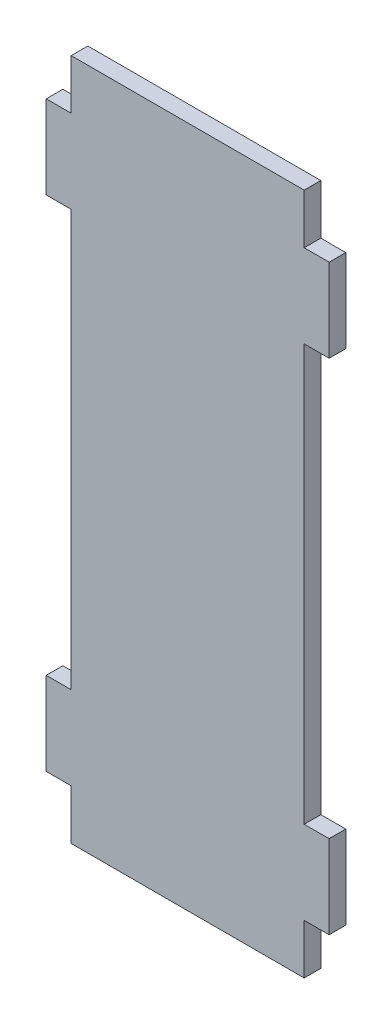
ISO-10303-21;
HEADER;
FILE_DESCRIPTION(('STEP AP214'),'2;1');
FILE_NAME('part.step','',(''),(''),'','','');
FILE_SCHEMA(('AUTOMOTIVE_DESIGN { 1 0 10303 214 1 1 1 1 }'));
ENDSEC;
DATA;
#1=APPLICATION_CONTEXT('core data for automotive mechanical design processes');
#2=APPLICATION_PROTOCOL_DEFINITION('international standard','automotive_design',2000,#1);
#3=PRODUCT_CONTEXT('',#1,'mechanical');
#4=PRODUCT('Part','Part','',(#3));
#5=PRODUCT_RELATED_PRODUCT_CATEGORY('part','',(#4));
#6=PRODUCT_DEFINITION_FORMATION('','',#4);
#7=PRODUCT_DEFINITION_CONTEXT('part definition',#1,'design');
#8=PRODUCT_DEFINITION('design','',#6,#7);
#9=PRODUCT_DEFINITION_SHAPE('','',#8);
#10=(LENGTH_UNIT() NAMED_UNIT(*) SI_UNIT(.MILLI.,.METRE.));
#11=(NAMED_UNIT(*) PLANE_ANGLE_UNIT() SI_UNIT($,.RADIAN.));
#12=(NAMED_UNIT(*) SI_UNIT($,.STERADIAN.) SOLID_ANGLE_UNIT());
#13=UNCERTAINTY_MEASURE_WITH_UNIT(LENGTH_MEASURE(1.E-05),#10,'distance_accuracy_value','');
#14=(GEOMETRIC_REPRESENTATION_CONTEXT(3) GLOBAL_UNCERTAINTY_ASSIGNED_CONTEXT((#13)) GLOBAL_UNIT_ASSIGNED_CONTEXT((#10,
#11,#12)) REPRESENTATION_CONTEXT('',''));
#15=CARTESIAN_POINT('',(0.,0.,0.));
#16=DIRECTION('',(0.,0.,1.));
#17=DIRECTION('',(1.,0.,0.));
#18=AXIS2_PLACEMENT_3D('',#15,#16,#17);
#19=CARTESIAN_POINT('',(28.,0.,-2.));
#20=DIRECTION('',(0.,1.,0.));
#21=DIRECTION('',(-1.,0.,0.));
#22=AXIS2_PLACEMENT_3D('',#19,#20,#21);
#23=PLANE('',#22);
#24=DIRECTION('',(-1.,0.,0.));
#25=VECTOR('',#24,1.);
#26=CARTESIAN_POINT('',(28.,0.,0.));
#27=LINE('',#26,#25);
#28=CARTESIAN_POINT('',(28.,0.,0.));
#29=VERTEX_POINT('',#28);
#30=CARTESIAN_POINT('',(0.,0.,0.));
#31=VERTEX_POINT('',#30);
#32=EDGE_CURVE('E214',#29,#31,#27,.T.);
#33=ORIENTED_EDGE('',*,*,#32,.F.);
#34=DIRECTION('',(0.,0.,1.));
#35=VECTOR('',#34,1.);
#36=CARTESIAN_POINT('',(28.,0.,-2.));
#37=LINE('',#36,#35);
#38=CARTESIAN_POINT('',(28.,0.,-2.));
#39=VERTEX_POINT('',#38);
#40=EDGE_CURVE('E11',#39,#29,#37,.T.);
#41=ORIENTED_EDGE('',*,*,#40,.F.);
#42=DIRECTION('',(-1.,0.,0.));
#43=VECTOR('',#42,1.);
#44=CARTESIAN_POINT('',(28.,0.,-2.));
#45=LINE('',#44,#43);
#46=CARTESIAN_POINT('',(0.,0.,-2.));
#47=VERTEX_POINT('',#46);
#48=EDGE_CURVE('E290',#39,#47,#45,.T.);
#49=ORIENTED_EDGE('',*,*,#48,.T.);
#50=DIRECTION('',(0.,0.,1.));
#51=VECTOR('',#50,1.);
#52=CARTESIAN_POINT('',(0.,0.,-2.));
#53=LINE('',#52,#51);
#54=EDGE_CURVE('E42',#47,#31,#53,.T.);
#55=ORIENTED_EDGE('',*,*,#54,.T.);
#56=EDGE_LOOP('',(#33,#41,#49,#55));
#57=FACE_BOUND('',#56,.T.);
#58=ADVANCED_FACE('F39',(#57),#23,.T.);
#59=CARTESIAN_POINT('',(28.,-6.,-2.));
#60=DIRECTION('',(1.,0.,0.));
#61=DIRECTION('',(0.,0.,-1.));
#62=AXIS2_PLACEMENT_3D('',#59,#60,#61);
#63=PLANE('',#62);
#64=DIRECTION('',(0.,1.,0.));
#65=VECTOR('',#64,1.);
#66=CARTESIAN_POINT('',(28.,-6.,0.));
#67=LINE('',#66,#65);
#68=CARTESIAN_POINT('',(28.,-6.,0.));
#69=VERTEX_POINT('',#68);
#70=EDGE_CURVE('E287',#69,#29,#67,.T.);
#71=ORIENTED_EDGE('',*,*,#70,.F.);
#72=DIRECTION('',(0.,0.,1.));
#73=VECTOR('',#72,1.);
#74=CARTESIAN_POINT('',(28.,-6.,-2.));
#75=LINE('',#74,#73);
#76=CARTESIAN_POINT('',(28.,-6.,-2.));
#77=VERTEX_POINT('',#76);
#78=EDGE_CURVE('E49',#77,#69,#75,.T.);
#79=ORIENTED_EDGE('',*,*,#78,.F.);
#80=DIRECTION('',(0.,1.,0.));
#81=VECTOR('',#80,1.);
#82=CARTESIAN_POINT('',(28.,-6.,-2.));
#83=LINE('',#82,#81);
#84=EDGE_CURVE('E200',#77,#39,#83,.T.);
#85=ORIENTED_EDGE('',*,*,#84,.T.);
#86=ORIENTED_EDGE('',*,*,#40,.T.);
#87=EDGE_LOOP('',(#71,#79,#85,#86));
#88=FACE_BOUND('',#87,.T.);
#89=ADVANCED_FACE('F344',(#88),#63,.T.);
#90=CARTESIAN_POINT('',(31.,-6.,-2.));
#91=DIRECTION('',(0.,1.,0.));
#92=DIRECTION('',(0.,0.,1.));
#93=AXIS2_PLACEMENT_3D('',#90,#91,#92);
#94=PLANE('',#93);
#95=DIRECTION('',(-1.,0.,0.));
#96=VECTOR('',#95,1.);
#97=CARTESIAN_POINT('',(31.,-6.,0.));
#98=LINE('',#97,#96);
#99=CARTESIAN_POINT('',(31.,-6.,0.));
#100=VERTEX_POINT('',#99);
#101=EDGE_CURVE('E186',#100,#69,#98,.T.);
#102=ORIENTED_EDGE('',*,*,#101,.F.);
#103=DIRECTION('',(0.,0.,1.));
#104=VECTOR('',#103,1.);
#105=CARTESIAN_POINT('',(31.,-6.,-2.));
#106=LINE('',#105,#104);
#107=CARTESIAN_POINT('',(31.,-6.,-2.));
#108=VERTEX_POINT('',#107);
#109=EDGE_CURVE('E181',#108,#100,#106,.T.);
#110=ORIENTED_EDGE('',*,*,#109,.F.);
#111=DIRECTION('',(-1.,0.,0.));
#112=VECTOR('',#111,1.);
#113=CARTESIAN_POINT('',(31.,-6.,-2.));
#114=LINE('',#113,#112);
#115=EDGE_CURVE('E184',#108,#77,#114,.T.);
#116=ORIENTED_EDGE('',*,*,#115,.T.);
#117=ORIENTED_EDGE('',*,*,#78,.T.);
#118=EDGE_LOOP('',(#102,#110,#116,#117));
#119=FACE_BOUND('',#118,.T.);
#120=ADVANCED_FACE('F183',(#119),#94,.T.);
#121=CARTESIAN_POINT('',(31.,-16.,-2.));
#122=DIRECTION('',(1.,0.,0.));
#123=DIRECTION('',(0.,0.,-1.));
#124=AXIS2_PLACEMENT_3D('',#121,#122,#123);
#125=PLANE('',#124);
#126=DIRECTION('',(0.,1.,0.));
#127=VECTOR('',#126,1.);
#128=CARTESIAN_POINT('',(31.,-16.,0.));
#129=LINE('',#128,#127);
#130=CARTESIAN_POINT('',(31.,-16.,0.));
#131=VERTEX_POINT('',#130);
#132=EDGE_CURVE('E282',#131,#100,#129,.T.);
#133=ORIENTED_EDGE('',*,*,#132,.F.);
#134=DIRECTION('',(0.,0.,1.));
#135=VECTOR('',#134,1.);
#136=CARTESIAN_POINT('',(31.,-16.,-2.));
#137=LINE('',#136,#135);
#138=CARTESIAN_POINT('',(31.,-16.,-2.));
#139=VERTEX_POINT('',#138);
#140=EDGE_CURVE('E192',#139,#131,#137,.T.);
#141=ORIENTED_EDGE('',*,*,#140,.F.);
#142=DIRECTION('',(0.,1.,0.));
#143=VECTOR('',#142,1.);
#144=CARTESIAN_POINT('',(31.,-16.,-2.));
#145=LINE('',#144,#143);
#146=EDGE_CURVE('E198',#139,#108,#145,.T.);
#147=ORIENTED_EDGE('',*,*,#146,.T.);
#148=ORIENTED_EDGE('',*,*,#109,.T.);
#149=EDGE_LOOP('',(#133,#141,#147,#148));
#150=FACE_BOUND('',#149,.T.);
#151=ADVANCED_FACE('F203',(#150),#125,.T.);
#152=CARTESIAN_POINT('',(31.,-16.,-2.));
#153=DIRECTION('',(0.,-1.,0.));
#154=DIRECTION('',(0.,0.,-1.));
#155=AXIS2_PLACEMENT_3D('',#152,#153,#154);
#156=PLANE('',#155);
#157=DIRECTION('',(1.,0.,0.));
#158=VECTOR('',#157,1.);
#159=CARTESIAN_POINT('',(31.,-16.,0.));
#160=LINE('',#159,#158);
#161=CARTESIAN_POINT('',(28.,-16.,0.));
#162=VERTEX_POINT('',#161);
#163=EDGE_CURVE('E278',#162,#131,#160,.T.);
#164=ORIENTED_EDGE('',*,*,#163,.F.);
#165=DIRECTION('',(0.,0.,1.));
#166=VECTOR('',#165,1.);
#167=CARTESIAN_POINT('',(28.,-16.,-2.));
#168=LINE('',#167,#166);
#169=CARTESIAN_POINT('',(28.,-16.,-2.));
#170=VERTEX_POINT('',#169);
#171=EDGE_CURVE('E296',#170,#162,#168,.T.);
#172=ORIENTED_EDGE('',*,*,#171,.F.);
#173=DIRECTION('',(1.,0.,0.));
#174=VECTOR('',#173,1.);
#175=CARTESIAN_POINT('',(31.,-16.,-2.));
#176=LINE('',#175,#174);
#177=EDGE_CURVE('E205',#170,#139,#176,.T.);
#178=ORIENTED_EDGE('',*,*,#177,.T.);
#179=ORIENTED_EDGE('',*,*,#140,.T.);
#180=EDGE_LOOP('',(#164,#172,#178,#179));
#181=FACE_BOUND('',#180,.T.);
#182=ADVANCED_FACE('F357',(#181),#156,.T.);
#183=CARTESIAN_POINT('',(28.,-16.,-2.));
#184=DIRECTION('',(1.,0.,0.));
#185=DIRECTION('',(0.,1.,0.));
#186=AXIS2_PLACEMENT_3D('',#183,#184,#185);
#187=PLANE('',#186);
#188=DIRECTION('',(0.,1.,0.));
#189=VECTOR('',#188,1.);
#190=CARTESIAN_POINT('',(28.,-16.,0.));
#191=LINE('',#190,#189);
#192=CARTESIAN_POINT('',(28.,-66.,0.));
#193=VERTEX_POINT('',#192);
#194=EDGE_CURVE('E274',#193,#162,#191,.T.);
#195=ORIENTED_EDGE('',*,*,#194,.F.);
#196=DIRECTION('',(0.,0.,1.));
#197=VECTOR('',#196,1.);
#198=CARTESIAN_POINT('',(28.,-66.,-2.));
#199=LINE('',#198,#197);
#200=CARTESIAN_POINT('',(28.,-66.,-2.));
#201=VERTEX_POINT('',#200);
#202=EDGE_CURVE('E299',#201,#193,#199,.T.);
#203=ORIENTED_EDGE('',*,*,#202,.F.);
#204=DIRECTION('',(0.,1.,0.));
#205=VECTOR('',#204,1.);
#206=CARTESIAN_POINT('',(28.,-16.,-2.));
#207=LINE('',#206,#205);
#208=EDGE_CURVE('E208',#201,#170,#207,.T.);
#209=ORIENTED_EDGE('',*,*,#208,.T.);
#210=ORIENTED_EDGE('',*,*,#171,.T.);
#211=EDGE_LOOP('',(#195,#203,#209,#210));
#212=FACE_BOUND('',#211,.T.);
#213=ADVANCED_FACE('F360',(#212),#187,.T.);
#214=CARTESIAN_POINT('',(28.,-66.,-2.));
#215=DIRECTION('',(0.,1.,0.));
#216=DIRECTION('',(0.,0.,1.));
#217=AXIS2_PLACEMENT_3D('',#214,#215,#216);
#218=PLANE('',#217);
#219=DIRECTION('',(-1.,0.,0.));
#220=VECTOR('',#219,1.);
#221=CARTESIAN_POINT('',(28.,-66.,0.));
#222=LINE('',#221,#220);
#223=CARTESIAN_POINT('',(31.,-66.,0.));
#224=VERTEX_POINT('',#223);
#225=EDGE_CURVE('E270',#224,#193,#222,.T.);
#226=ORIENTED_EDGE('',*,*,#225,.F.);
#227=DIRECTION('',(0.,0.,1.));
#228=VECTOR('',#227,1.);
#229=CARTESIAN_POINT('',(31.,-66.,-2.));
#230=LINE('',#229,#228);
#231=CARTESIAN_POINT('',(31.,-66.,-2.));
#232=VERTEX_POINT('',#231);
#233=EDGE_CURVE('E302',#232,#224,#230,.T.);
#234=ORIENTED_EDGE('',*,*,#233,.F.);
#235=DIRECTION('',(-1.,0.,0.));
#236=VECTOR('',#235,1.);
#237=CARTESIAN_POINT('',(28.,-66.,-2.));
#238=LINE('',#237,#236);
#239=EDGE_CURVE('E599',#232,#201,#238,.T.);
#240=ORIENTED_EDGE('',*,*,#239,.T.);
#241=ORIENTED_EDGE('',*,*,#202,.T.);
#242=EDGE_LOOP('',(#226,#234,#240,#241));
#243=FACE_BOUND('',#242,.T.);
#244=ADVANCED_FACE('F364',(#243),#218,.T.);
#245=CARTESIAN_POINT('',(31.,-76.,-2.));
#246=DIRECTION('',(1.,0.,0.));
#247=DIRECTION('',(0.,0.,-1.));
#248=AXIS2_PLACEMENT_3D('',#245,#246,#247);
#249=PLANE('',#248);
#250=DIRECTION('',(0.,1.,0.));
#251=VECTOR('',#250,1.);
#252=CARTESIAN_POINT('',(31.,-76.,0.));
#253=LINE('',#252,#251);
#254=CARTESIAN_POINT('',(31.,-76.,0.));
#255=VERTEX_POINT('',#254);
#256=EDGE_CURVE('E266',#255,#224,#253,.T.);
#257=ORIENTED_EDGE('',*,*,#256,.F.);
#258=DIRECTION('',(0.,0.,1.));
#259=VECTOR('',#258,1.);
#260=CARTESIAN_POINT('',(31.,-76.,-2.));
#261=LINE('',#260,#259);
#262=CARTESIAN_POINT('',(31.,-76.,-2.));
#263=VERTEX_POINT('',#262);
#264=EDGE_CURVE('E305',#263,#255,#261,.T.);
#265=ORIENTED_EDGE('',*,*,#264,.F.);
#266=DIRECTION('',(0.,1.,0.));
#267=VECTOR('',#266,1.);
#268=CARTESIAN_POINT('',(31.,-76.,-2.));
#269=LINE('',#268,#267);
#270=EDGE_CURVE('E592',#263,#232,#269,.T.);
#271=ORIENTED_EDGE('',*,*,#270,.T.);
#272=ORIENTED_EDGE('',*,*,#233,.T.);
#273=EDGE_LOOP('',(#257,#265,#271,#272));
#274=FACE_BOUND('',#273,.T.);
#275=ADVANCED_FACE('F368',(#274),#249,.T.);
#276=CARTESIAN_POINT('',(31.,-76.,-2.));
#277=DIRECTION('',(0.,-1.,0.));
#278=DIRECTION('',(0.,0.,-1.));
#279=AXIS2_PLACEMENT_3D('',#276,#277,#278);
#280=PLANE('',#279);
#281=DIRECTION('',(1.,0.,0.));
#282=VECTOR('',#281,1.);
#283=CARTESIAN_POINT('',(31.,-76.,0.));
#284=LINE('',#283,#282);
#285=CARTESIAN_POINT('',(28.,-76.,0.));
#286=VERTEX_POINT('',#285);
#287=EDGE_CURVE('E262',#286,#255,#284,.T.);
#288=ORIENTED_EDGE('',*,*,#287,.F.);
#289=DIRECTION('',(0.,0.,1.));
#290=VECTOR('',#289,1.);
#291=CARTESIAN_POINT('',(28.,-76.,-2.));
#292=LINE('',#291,#290);
#293=CARTESIAN_POINT('',(28.,-76.,-2.));
#294=VERTEX_POINT('',#293);
#295=EDGE_CURVE('E308',#294,#286,#292,.T.);
#296=ORIENTED_EDGE('',*,*,#295,.F.);
#297=DIRECTION('',(1.,0.,0.));
#298=VECTOR('',#297,1.);
#299=CARTESIAN_POINT('',(31.,-76.,-2.));
#300=LINE('',#299,#298);
#301=EDGE_CURVE('E588',#294,#263,#300,.T.);
#302=ORIENTED_EDGE('',*,*,#301,.T.);
#303=ORIENTED_EDGE('',*,*,#264,.T.);
#304=EDGE_LOOP('',(#288,#296,#302,#303));
#305=FACE_BOUND('',#304,.T.);
#306=ADVANCED_FACE('F372',(#305),#280,.T.);
#307=CARTESIAN_POINT('',(28.,-76.,-2.));
#308=DIRECTION('',(1.,0.,0.));
#309=DIRECTION('',(0.,0.,-1.));
#310=AXIS2_PLACEMENT_3D('',#307,#308,#309);
#311=PLANE('',#310);
#312=DIRECTION('',(0.,1.,0.));
#313=VECTOR('',#312,1.);
#314=CARTESIAN_POINT('',(28.,-76.,0.));
#315=LINE('',#314,#313);
#316=CARTESIAN_POINT('',(28.,-82.,0.));
#317=VERTEX_POINT('',#316);
#318=EDGE_CURVE('E258',#317,#286,#315,.T.);
#319=ORIENTED_EDGE('',*,*,#318,.F.);
#320=DIRECTION('',(0.,0.,1.));
#321=VECTOR('',#320,1.);
#322=CARTESIAN_POINT('',(28.,-82.,-2.));
#323=LINE('',#322,#321);
#324=CARTESIAN_POINT('',(28.,-82.,-2.));
#325=VERTEX_POINT('',#324);
#326=EDGE_CURVE('E311',#325,#317,#323,.T.);
#327=ORIENTED_EDGE('',*,*,#326,.F.);
#328=DIRECTION('',(0.,1.,0.));
#329=VECTOR('',#328,1.);
#330=CARTESIAN_POINT('',(28.,-76.,-2.));
#331=LINE('',#330,#329);
#332=EDGE_CURVE('E608',#325,#294,#331,.T.);
#333=ORIENTED_EDGE('',*,*,#332,.T.);
#334=ORIENTED_EDGE('',*,*,#295,.T.);
#335=EDGE_LOOP('',(#319,#327,#333,#334));
#336=FACE_BOUND('',#335,.T.);
#337=ADVANCED_FACE('F376',(#336),#311,.T.);
#338=CARTESIAN_POINT('',(0.,-82.,-2.));
#339=DIRECTION('',(0.,-1.,0.));
#340=DIRECTION('',(1.,0.,0.));
#341=AXIS2_PLACEMENT_3D('',#338,#339,#340);
#342=PLANE('',#341);
#343=DIRECTION('',(1.,0.,0.));
#344=VECTOR('',#343,1.);
#345=CARTESIAN_POINT('',(0.,-82.,0.));
#346=LINE('',#345,#344);
#347=CARTESIAN_POINT('',(0.,-82.,0.));
#348=VERTEX_POINT('',#347);
#349=EDGE_CURVE('E254',#348,#317,#346,.T.);
#350=ORIENTED_EDGE('',*,*,#349,.F.);
#351=DIRECTION('',(0.,0.,1.));
#352=VECTOR('',#351,1.);
#353=CARTESIAN_POINT('',(0.,-82.,-2.));
#354=LINE('',#353,#352);
#355=CARTESIAN_POINT('',(0.,-82.,-2.));
#356=VERTEX_POINT('',#355);
#357=EDGE_CURVE('E314',#356,#348,#354,.T.);
#358=ORIENTED_EDGE('',*,*,#357,.F.);
#359=DIRECTION('',(1.,0.,0.));
#360=VECTOR('',#359,1.);
#361=CARTESIAN_POINT('',(0.,-82.,-2.));
#362=LINE('',#361,#360);
#363=EDGE_CURVE('E581',#356,#325,#362,.T.);
#364=ORIENTED_EDGE('',*,*,#363,.T.);
#365=ORIENTED_EDGE('',*,*,#326,.T.);
#366=EDGE_LOOP('',(#350,#358,#364,#365));
#367=FACE_BOUND('',#366,.T.);
#368=ADVANCED_FACE('F380',(#367),#342,.T.);
#369=CARTESIAN_POINT('',(0.,-76.,-2.));
#370=DIRECTION('',(-1.,0.,0.));
#371=DIRECTION('',(0.,-1.,0.));
#372=AXIS2_PLACEMENT_3D('',#369,#370,#371);
#373=PLANE('',#372);
#374=DIRECTION('',(0.,-1.,0.));
#375=VECTOR('',#374,1.);
#376=CARTESIAN_POINT('',(0.,-76.,0.));
#377=LINE('',#376,#375);
#378=CARTESIAN_POINT('',(0.,-76.,0.));
#379=VERTEX_POINT('',#378);
#380=EDGE_CURVE('E250',#379,#348,#377,.T.);
#381=ORIENTED_EDGE('',*,*,#380,.F.);
#382=DIRECTION('',(0.,0.,1.));
#383=VECTOR('',#382,1.);
#384=CARTESIAN_POINT('',(0.,-76.,-2.));
#385=LINE('',#384,#383);
#386=CARTESIAN_POINT('',(0.,-76.,-2.));
#387=VERTEX_POINT('',#386);
#388=EDGE_CURVE('E317',#387,#379,#385,.T.);
#389=ORIENTED_EDGE('',*,*,#388,.F.);
#390=DIRECTION('',(0.,-1.,0.));
#391=VECTOR('',#390,1.);
#392=CARTESIAN_POINT('',(0.,-76.,-2.));
#393=LINE('',#392,#391);
#394=EDGE_CURVE('E577',#387,#356,#393,.T.);
#395=ORIENTED_EDGE('',*,*,#394,.T.);
#396=ORIENTED_EDGE('',*,*,#357,.T.);
#397=EDGE_LOOP('',(#381,#389,#395,#396));
#398=FACE_BOUND('',#397,.T.);
#399=ADVANCED_FACE('F384',(#398),#373,.T.);
#400=CARTESIAN_POINT('',(-2.99999999999999,-76.,-2.));
#401=DIRECTION('',(0.,-1.,0.));
#402=DIRECTION('',(0.,0.,-1.));
#403=AXIS2_PLACEMENT_3D('',#400,#401,#402);
#404=PLANE('',#403);
#405=DIRECTION('',(1.,0.,0.));
#406=VECTOR('',#405,1.);
#407=CARTESIAN_POINT('',(-2.99999999999999,-76.,0.));
#408=LINE('',#407,#406);
#409=CARTESIAN_POINT('',(-2.99999999999999,-76.,0.));
#410=VERTEX_POINT('',#409);
#411=EDGE_CURVE('E246',#410,#379,#408,.T.);
#412=ORIENTED_EDGE('',*,*,#411,.F.);
#413=DIRECTION('',(0.,0.,1.));
#414=VECTOR('',#413,1.);
#415=CARTESIAN_POINT('',(-2.99999999999999,-76.,-2.));
#416=LINE('',#415,#414);
#417=CARTESIAN_POINT('',(-2.99999999999999,-76.,-2.));
#418=VERTEX_POINT('',#417);
#419=EDGE_CURVE('E320',#418,#410,#416,.T.);
#420=ORIENTED_EDGE('',*,*,#419,.F.);
#421=DIRECTION('',(1.,0.,0.));
#422=VECTOR('',#421,1.);
#423=CARTESIAN_POINT('',(-2.99999999999999,-76.,-2.));
#424=LINE('',#423,#422);
#425=EDGE_CURVE('E615',#418,#387,#424,.T.);
#426=ORIENTED_EDGE('',*,*,#425,.T.);
#427=ORIENTED_EDGE('',*,*,#388,.T.);
#428=EDGE_LOOP('',(#412,#420,#426,#427));
#429=FACE_BOUND('',#428,.T.);
#430=ADVANCED_FACE('F388',(#429),#404,.T.);
#431=CARTESIAN_POINT('',(-2.99999999999999,-66.,-2.));
#432=DIRECTION('',(-1.,0.,0.));
#433=DIRECTION('',(0.,-1.,0.));
#434=AXIS2_PLACEMENT_3D('',#431,#432,#433);
#435=PLANE('',#434);
#436=DIRECTION('',(0.,-1.,0.));
#437=VECTOR('',#436,1.);
#438=CARTESIAN_POINT('',(-2.99999999999999,-66.,0.));
#439=LINE('',#438,#437);
#440=CARTESIAN_POINT('',(-2.99999999999999,-66.,0.));
#441=VERTEX_POINT('',#440);
#442=EDGE_CURVE('E242',#441,#410,#439,.T.);
#443=ORIENTED_EDGE('',*,*,#442,.F.);
#444=DIRECTION('',(0.,0.,1.));
#445=VECTOR('',#444,1.);
#446=CARTESIAN_POINT('',(-2.99999999999999,-66.,-2.));
#447=LINE('',#446,#445);
#448=CARTESIAN_POINT('',(-2.99999999999999,-66.,-2.));
#449=VERTEX_POINT('',#448);
#450=EDGE_CURVE('E323',#449,#441,#447,.T.);
#451=ORIENTED_EDGE('',*,*,#450,.F.);
#452=DIRECTION('',(0.,-1.,0.));
#453=VECTOR('',#452,1.);
#454=CARTESIAN_POINT('',(-2.99999999999999,-66.,-2.));
#455=LINE('',#454,#453);
#456=EDGE_CURVE('E570',#449,#418,#455,.T.);
#457=ORIENTED_EDGE('',*,*,#456,.T.);
#458=ORIENTED_EDGE('',*,*,#419,.T.);
#459=EDGE_LOOP('',(#443,#451,#457,#458));
#460=FACE_BOUND('',#459,.T.);
#461=ADVANCED_FACE('F392',(#460),#435,.T.);
#462=CARTESIAN_POINT('',(0.,-66.,-2.));
#463=DIRECTION('',(0.,1.,0.));
#464=DIRECTION('',(0.,0.,1.));
#465=AXIS2_PLACEMENT_3D('',#462,#463,#464);
#466=PLANE('',#465);
#467=DIRECTION('',(-1.,0.,0.));
#468=VECTOR('',#467,1.);
#469=CARTESIAN_POINT('',(0.,-66.,0.));
#470=LINE('',#469,#468);
#471=CARTESIAN_POINT('',(0.,-66.,0.));
#472=VERTEX_POINT('',#471);
#473=EDGE_CURVE('E238',#472,#441,#470,.T.);
#474=ORIENTED_EDGE('',*,*,#473,.F.);
#475=DIRECTION('',(0.,0.,1.));
#476=VECTOR('',#475,1.);
#477=CARTESIAN_POINT('',(0.,-66.,-2.));
#478=LINE('',#477,#476);
#479=CARTESIAN_POINT('',(0.,-66.,-2.));
#480=VERTEX_POINT('',#479);
#481=EDGE_CURVE('E326',#480,#472,#478,.T.);
#482=ORIENTED_EDGE('',*,*,#481,.F.);
#483=DIRECTION('',(-1.,0.,0.));
#484=VECTOR('',#483,1.);
#485=CARTESIAN_POINT('',(0.,-66.,-2.));
#486=LINE('',#485,#484);
#487=EDGE_CURVE('E566',#480,#449,#486,.T.);
#488=ORIENTED_EDGE('',*,*,#487,.T.);
#489=ORIENTED_EDGE('',*,*,#450,.T.);
#490=EDGE_LOOP('',(#474,#482,#488,#489));
#491=FACE_BOUND('',#490,.T.);
#492=ADVANCED_FACE('F396',(#491),#466,.T.);
#493=CARTESIAN_POINT('',(0.,-16.,-2.));
#494=DIRECTION('',(-1.,0.,0.));
#495=DIRECTION('',(0.,-1.,0.));
#496=AXIS2_PLACEMENT_3D('',#493,#494,#495);
#497=PLANE('',#496);
#498=DIRECTION('',(0.,-1.,0.));
#499=VECTOR('',#498,1.);
#500=CARTESIAN_POINT('',(0.,-16.,0.));
#501=LINE('',#500,#499);
#502=CARTESIAN_POINT('',(0.,-16.,0.));
#503=VERTEX_POINT('',#502);
#504=EDGE_CURVE('E234',#503,#472,#501,.T.);
#505=ORIENTED_EDGE('',*,*,#504,.F.);
#506=DIRECTION('',(0.,0.,1.));
#507=VECTOR('',#506,1.);
#508=CARTESIAN_POINT('',(0.,-16.,-2.));
#509=LINE('',#508,#507);
#510=CARTESIAN_POINT('',(0.,-16.,-2.));
#511=VERTEX_POINT('',#510);
#512=EDGE_CURVE('E329',#511,#503,#509,.T.);
#513=ORIENTED_EDGE('',*,*,#512,.F.);
#514=DIRECTION('',(0.,-1.,0.));
#515=VECTOR('',#514,1.);
#516=CARTESIAN_POINT('',(0.,-16.,-2.));
#517=LINE('',#516,#515);
#518=EDGE_CURVE('E622',#511,#480,#517,.T.);
#519=ORIENTED_EDGE('',*,*,#518,.T.);
#520=ORIENTED_EDGE('',*,*,#481,.T.);
#521=EDGE_LOOP('',(#505,#513,#519,#520));
#522=FACE_BOUND('',#521,.T.);
#523=ADVANCED_FACE('F400',(#522),#497,.T.);
#524=CARTESIAN_POINT('',(-3.,-16.,-2.));
#525=DIRECTION('',(0.,-1.,0.));
#526=DIRECTION('',(0.,0.,-1.));
#527=AXIS2_PLACEMENT_3D('',#524,#525,#526);
#528=PLANE('',#527);
#529=DIRECTION('',(1.,0.,0.));
#530=VECTOR('',#529,1.);
#531=CARTESIAN_POINT('',(-3.,-16.,0.));
#532=LINE('',#531,#530);
#533=CARTESIAN_POINT('',(-3.,-16.,0.));
#534=VERTEX_POINT('',#533);
#535=EDGE_CURVE('E230',#534,#503,#532,.T.);
#536=ORIENTED_EDGE('',*,*,#535,.F.);
#537=DIRECTION('',(0.,0.,1.));
#538=VECTOR('',#537,1.);
#539=CARTESIAN_POINT('',(-3.,-16.,-2.));
#540=LINE('',#539,#538);
#541=CARTESIAN_POINT('',(-3.,-16.,-2.));
#542=VERTEX_POINT('',#541);
#543=EDGE_CURVE('E332',#542,#534,#540,.T.);
#544=ORIENTED_EDGE('',*,*,#543,.F.);
#545=DIRECTION('',(1.,0.,0.));
#546=VECTOR('',#545,1.);
#547=CARTESIAN_POINT('',(-3.,-16.,-2.));
#548=LINE('',#547,#546);
#549=EDGE_CURVE('E559',#542,#511,#548,.T.);
#550=ORIENTED_EDGE('',*,*,#549,.T.);
#551=ORIENTED_EDGE('',*,*,#512,.T.);
#552=EDGE_LOOP('',(#536,#544,#550,#551));
#553=FACE_BOUND('',#552,.T.);
#554=ADVANCED_FACE('F404',(#553),#528,.T.);
#555=CARTESIAN_POINT('',(-3.,-6.,-2.));
#556=DIRECTION('',(-1.,0.,0.));
#557=DIRECTION('',(0.,-1.,0.));
#558=AXIS2_PLACEMENT_3D('',#555,#556,#557);
#559=PLANE('',#558);
#560=DIRECTION('',(0.,-1.,0.));
#561=VECTOR('',#560,1.);
#562=CARTESIAN_POINT('',(-3.,-6.,0.));
#563=LINE('',#562,#561);
#564=CARTESIAN_POINT('',(-3.,-6.,0.));
#565=VERTEX_POINT('',#564);
#566=EDGE_CURVE('E226',#565,#534,#563,.T.);
#567=ORIENTED_EDGE('',*,*,#566,.F.);
#568=DIRECTION('',(0.,0.,1.));
#569=VECTOR('',#568,1.);
#570=CARTESIAN_POINT('',(-3.,-6.,-2.));
#571=LINE('',#570,#569);
#572=CARTESIAN_POINT('',(-3.,-6.,-2.));
#573=VERTEX_POINT('',#572);
#574=EDGE_CURVE('E335',#573,#565,#571,.T.);
#575=ORIENTED_EDGE('',*,*,#574,.F.);
#576=DIRECTION('',(0.,-1.,0.));
#577=VECTOR('',#576,1.);
#578=CARTESIAN_POINT('',(-3.,-6.,-2.));
#579=LINE('',#578,#577);
#580=EDGE_CURVE('E555',#573,#542,#579,.T.);
#581=ORIENTED_EDGE('',*,*,#580,.T.);
#582=ORIENTED_EDGE('',*,*,#543,.T.);
#583=EDGE_LOOP('',(#567,#575,#581,#582));
#584=FACE_BOUND('',#583,.T.);
#585=ADVANCED_FACE('F408',(#584),#559,.T.);
#586=CARTESIAN_POINT('',(0.,-6.,-2.));
#587=DIRECTION('',(0.,1.,0.));
#588=DIRECTION('',(0.,0.,1.));
#589=AXIS2_PLACEMENT_3D('',#586,#587,#588);
#590=PLANE('',#589);
#591=DIRECTION('',(-1.,0.,0.));
#592=VECTOR('',#591,1.);
#593=CARTESIAN_POINT('',(0.,-6.,0.));
#594=LINE('',#593,#592);
#595=CARTESIAN_POINT('',(0.,-6.,0.));
#596=VERTEX_POINT('',#595);
#597=EDGE_CURVE('E222',#596,#565,#594,.T.);
#598=ORIENTED_EDGE('',*,*,#597,.F.);
#599=DIRECTION('',(0.,0.,1.));
#600=VECTOR('',#599,1.);
#601=CARTESIAN_POINT('',(0.,-6.,-2.));
#602=LINE('',#601,#600);
#603=CARTESIAN_POINT('',(0.,-6.,-2.));
#604=VERTEX_POINT('',#603);
#605=EDGE_CURVE('E337',#604,#596,#602,.T.);
#606=ORIENTED_EDGE('',*,*,#605,.F.);
#607=DIRECTION('',(-1.,0.,0.));
#608=VECTOR('',#607,1.);
#609=CARTESIAN_POINT('',(0.,-6.,-2.));
#610=LINE('',#609,#608);
#611=EDGE_CURVE('E629',#604,#573,#610,.T.);
#612=ORIENTED_EDGE('',*,*,#611,.T.);
#613=ORIENTED_EDGE('',*,*,#574,.T.);
#614=EDGE_LOOP('',(#598,#606,#612,#613));
#615=FACE_BOUND('',#614,.T.);
#616=ADVANCED_FACE('F412',(#615),#590,.T.);
#617=CARTESIAN_POINT('',(0.,0.,-2.));
#618=DIRECTION('',(-1.,0.,0.));
#619=DIRECTION('',(0.,-1.,0.));
#620=AXIS2_PLACEMENT_3D('',#617,#618,#619);
#621=PLANE('',#620);
#622=DIRECTION('',(0.,-1.,0.));
#623=VECTOR('',#622,1.);
#624=CARTESIAN_POINT('',(0.,0.,0.));
#625=LINE('',#624,#623);
#626=EDGE_CURVE('E218',#31,#596,#625,.T.);
#627=ORIENTED_EDGE('',*,*,#626,.F.);
#628=ORIENTED_EDGE('',*,*,#54,.F.);
#629=DIRECTION('',(0.,-1.,0.));
#630=VECTOR('',#629,1.);
#631=CARTESIAN_POINT('',(0.,0.,-2.));
#632=LINE('',#631,#630);
#633=EDGE_CURVE('E632',#47,#604,#632,.T.);
#634=ORIENTED_EDGE('',*,*,#633,.T.);
#635=ORIENTED_EDGE('',*,*,#605,.T.);
#636=EDGE_LOOP('',(#627,#628,#634,#635));
#637=FACE_BOUND('',#636,.T.);
#638=ADVANCED_FACE('F341',(#637),#621,.T.);
#639=CARTESIAN_POINT('',(0.,0.,-2.));
#640=DIRECTION('',(0.,0.,1.));
#641=DIRECTION('',(1.,0.,0.));
#642=AXIS2_PLACEMENT_3D('',#639,#640,#641);
#643=PLANE('',#642);
#644=ORIENTED_EDGE('',*,*,#48,.F.);
#645=ORIENTED_EDGE('',*,*,#84,.F.);
#646=ORIENTED_EDGE('',*,*,#115,.F.);
#647=ORIENTED_EDGE('',*,*,#146,.F.);
#648=ORIENTED_EDGE('',*,*,#177,.F.);
#649=ORIENTED_EDGE('',*,*,#208,.F.);
#650=ORIENTED_EDGE('',*,*,#239,.F.);
#651=ORIENTED_EDGE('',*,*,#270,.F.);
#652=ORIENTED_EDGE('',*,*,#301,.F.);
#653=ORIENTED_EDGE('',*,*,#332,.F.);
#654=ORIENTED_EDGE('',*,*,#363,.F.);
#655=ORIENTED_EDGE('',*,*,#394,.F.);
#656=ORIENTED_EDGE('',*,*,#425,.F.);
#657=ORIENTED_EDGE('',*,*,#456,.F.);
#658=ORIENTED_EDGE('',*,*,#487,.F.);
#659=ORIENTED_EDGE('',*,*,#518,.F.);
#660=ORIENTED_EDGE('',*,*,#549,.F.);
#661=ORIENTED_EDGE('',*,*,#580,.F.);
#662=ORIENTED_EDGE('',*,*,#611,.F.);
#663=ORIENTED_EDGE('',*,*,#633,.F.);
#664=EDGE_LOOP('',(#644,#645,#646,#647,#648,#649,#650,#651,#652,#653,#654,#655,#656,#657,#658,
#659,#660,#661,#662,#663));
#665=FACE_BOUND('',#664,.T.);
#666=ADVANCED_FACE('F196',(#665),#643,.F.);
#667=CARTESIAN_POINT('',(0.,0.,0.));
#668=DIRECTION('',(0.,0.,1.));
#669=DIRECTION('',(1.,0.,0.));
#670=AXIS2_PLACEMENT_3D('',#667,#668,#669);
#671=PLANE('',#670);
#672=ORIENTED_EDGE('',*,*,#32,.T.);
#673=ORIENTED_EDGE('',*,*,#626,.T.);
#674=ORIENTED_EDGE('',*,*,#597,.T.);
#675=ORIENTED_EDGE('',*,*,#566,.T.);
#676=ORIENTED_EDGE('',*,*,#535,.T.);
#677=ORIENTED_EDGE('',*,*,#504,.T.);
#678=ORIENTED_EDGE('',*,*,#473,.T.);
#679=ORIENTED_EDGE('',*,*,#442,.T.);
#680=ORIENTED_EDGE('',*,*,#411,.T.);
#681=ORIENTED_EDGE('',*,*,#380,.T.);
#682=ORIENTED_EDGE('',*,*,#349,.T.);
#683=ORIENTED_EDGE('',*,*,#318,.T.);
#684=ORIENTED_EDGE('',*,*,#287,.T.);
#685=ORIENTED_EDGE('',*,*,#256,.T.);
#686=ORIENTED_EDGE('',*,*,#225,.T.);
#687=ORIENTED_EDGE('',*,*,#194,.T.);
#688=ORIENTED_EDGE('',*,*,#163,.T.);
#689=ORIENTED_EDGE('',*,*,#132,.T.);
#690=ORIENTED_EDGE('',*,*,#101,.T.);
#691=ORIENTED_EDGE('',*,*,#70,.T.);
#692=EDGE_LOOP('',(#672,#673,#674,#675,#676,#677,#678,#679,#680,#681,#682,#683,#684,#685,#686,
#687,#688,#689,#690,#691));
#693=FACE_BOUND('',#692,.T.);
#694=ADVANCED_FACE('F343',(#693),#671,.T.);
#695=CLOSED_SHELL('',(#58,#89,#120,#151,#182,#213,#244,#275,#306,#337,#368,#399,#430,#461,#492,
#523,#554,#585,#616,#638,#666,#694));
#696=MANIFOLD_SOLID_BREP('B2',#695);
#697=ADVANCED_BREP_SHAPE_REPRESENTATION('',(#18,#696),#14);
#698=SHAPE_DEFINITION_REPRESENTATION(#9,#697);
ENDSEC;
END-ISO-10303-21;
